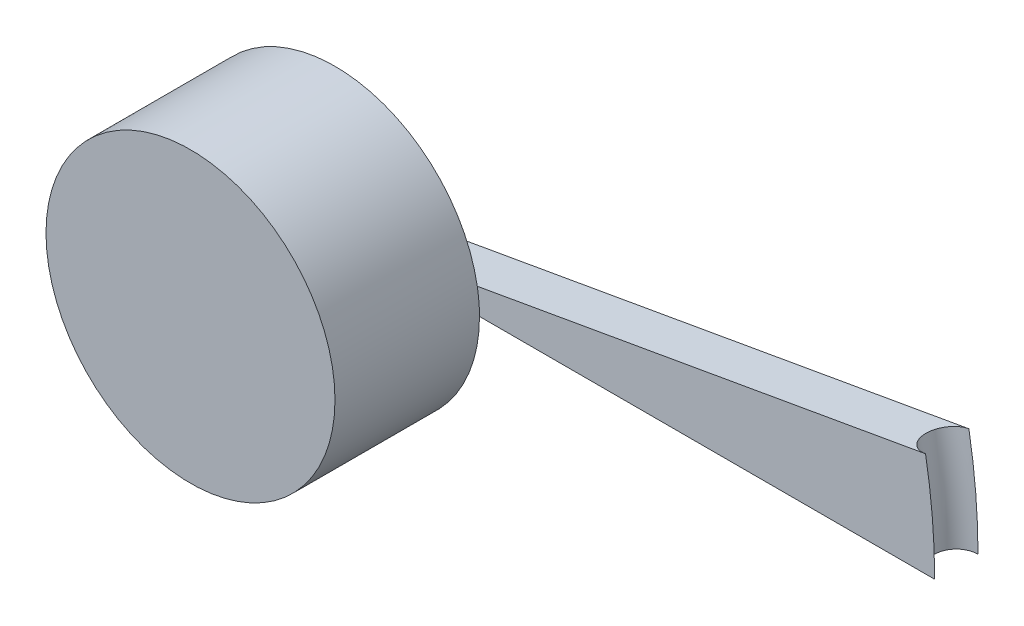
ISO-10303-21;
HEADER;
FILE_DESCRIPTION(('STEP AP214'),'2;1');
FILE_NAME('part.step','',(''),(''),'','','');
FILE_SCHEMA(('AUTOMOTIVE_DESIGN { 1 0 10303 214 1 1 1 1 }'));
ENDSEC;
DATA;
#1=APPLICATION_CONTEXT('core data for automotive mechanical design processes');
#2=APPLICATION_PROTOCOL_DEFINITION('international standard','automotive_design',2000,#1);
#3=PRODUCT_CONTEXT('',#1,'mechanical');
#4=PRODUCT('Part','Part','',(#3));
#5=PRODUCT_RELATED_PRODUCT_CATEGORY('part','',(#4));
#6=PRODUCT_DEFINITION_FORMATION('','',#4);
#7=PRODUCT_DEFINITION_CONTEXT('part definition',#1,'design');
#8=PRODUCT_DEFINITION('design','',#6,#7);
#9=PRODUCT_DEFINITION_SHAPE('','',#8);
#10=(LENGTH_UNIT() NAMED_UNIT(*) SI_UNIT(.MILLI.,.METRE.));
#11=(NAMED_UNIT(*) PLANE_ANGLE_UNIT() SI_UNIT($,.RADIAN.));
#12=(NAMED_UNIT(*) SI_UNIT($,.STERADIAN.) SOLID_ANGLE_UNIT());
#13=UNCERTAINTY_MEASURE_WITH_UNIT(LENGTH_MEASURE(1.E-05),#10,'distance_accuracy_value','');
#14=(GEOMETRIC_REPRESENTATION_CONTEXT(3) GLOBAL_UNCERTAINTY_ASSIGNED_CONTEXT((#13)) GLOBAL_UNIT_ASSIGNED_CONTEXT((#10,
#11,#12)) REPRESENTATION_CONTEXT('',''));
#15=CARTESIAN_POINT('',(0.,0.,0.));
#16=DIRECTION('',(0.,0.,1.));
#17=DIRECTION('',(1.,0.,0.));
#18=AXIS2_PLACEMENT_3D('',#15,#16,#17);
#19=CARTESIAN_POINT('',(40.8695217500066,7.20639937317762,1.5));
#20=DIRECTION('',(0.,0.,-1.));
#21=DIRECTION('',(-1.,0.,0.));
#22=AXIS2_PLACEMENT_3D('',#19,#20,#21);
#23=PLANE('',#22);
#24=CARTESIAN_POINT('',(0.,0.,1.50000000000001));
#25=DIRECTION('',(0.,0.,1.));
#26=DIRECTION('',(1.,0.,0.));
#27=AXIS2_PLACEMENT_3D('',#24,#25,#26);
#28=CIRCLE('',#27,10.);
#29=CARTESIAN_POINT('',(10.,0.,1.50000000000001));
#30=VERTEX_POINT('',#29);
#31=CARTESIAN_POINT('',(9.84807753012208,1.73648177666931,1.5));
#32=VERTEX_POINT('',#31);
#33=EDGE_CURVE('E87',#30,#32,#28,.T.);
#34=ORIENTED_EDGE('',*,*,#33,.F.);
#35=DIRECTION('',(1.,0.,0.));
#36=VECTOR('',#35,1.);
#37=CARTESIAN_POINT('',(0.,0.,1.5));
#38=LINE('',#37,#36);
#39=CARTESIAN_POINT('',(41.5,0.,1.5));
#40=VERTEX_POINT('',#39);
#41=EDGE_CURVE('E77',#30,#40,#38,.T.);
#42=ORIENTED_EDGE('',*,*,#41,.T.);
#43=CARTESIAN_POINT('',(0.,0.,1.50000000000002));
#44=DIRECTION('',(0.,0.,-1.));
#45=DIRECTION('',(-1.,0.,0.));
#46=AXIS2_PLACEMENT_3D('',#43,#44,#45);
#47=CIRCLE('',#46,41.5);
#48=CARTESIAN_POINT('',(40.8695217500066,7.20639937317762,1.5));
#49=VERTEX_POINT('',#48);
#50=EDGE_CURVE('E11',#49,#40,#47,.T.);
#51=ORIENTED_EDGE('',*,*,#50,.F.);
#52=DIRECTION('',(0.984807753012208,0.173648177666931,0.));
#53=VECTOR('',#52,1.);
#54=CARTESIAN_POINT('',(0.,0.,1.5));
#55=LINE('',#54,#53);
#56=EDGE_CURVE('E49',#32,#49,#55,.T.);
#57=ORIENTED_EDGE('',*,*,#56,.F.);
#58=EDGE_LOOP('',(#34,#42,#51,#57));
#59=FACE_BOUND('',#58,.T.);
#60=ADVANCED_FACE('F35',(#59),#23,.F.);
#61=CARTESIAN_POINT('',(0.,0.,0.));
#62=DIRECTION('',(0.,0.,-1.));
#63=DIRECTION('',(-1.,0.,0.));
#64=AXIS2_PLACEMENT_3D('',#61,#62,#63);
#65=TOROIDAL_SURFACE('',#64,41.5,1.5);
#66=CARTESIAN_POINT('',(0.,0.,-1.49999999999999));
#67=DIRECTION('',(0.,0.,-1.));
#68=DIRECTION('',(-1.,0.,0.));
#69=AXIS2_PLACEMENT_3D('',#66,#67,#68);
#70=CIRCLE('',#69,41.5);
#71=CARTESIAN_POINT('',(40.8695217500066,7.20639937317762,-1.5));
#72=VERTEX_POINT('',#71);
#73=CARTESIAN_POINT('',(41.5,0.,-1.5));
#74=VERTEX_POINT('',#73);
#75=EDGE_CURVE('E42',#72,#74,#70,.T.);
#76=ORIENTED_EDGE('',*,*,#75,.F.);
#77=CARTESIAN_POINT('',(40.8695217500066,7.20639937317762,0.));
#78=DIRECTION('',(0.173648177666931,-0.984807753012208,0.));
#79=DIRECTION('',(0.,0.,1.));
#80=AXIS2_PLACEMENT_3D('',#77,#78,#79);
#81=CIRCLE('',#80,1.5);
#82=EDGE_CURVE('E106',#49,#72,#81,.T.);
#83=ORIENTED_EDGE('',*,*,#82,.F.);
#84=ORIENTED_EDGE('',*,*,#50,.T.);
#85=CARTESIAN_POINT('',(41.5,0.,0.));
#86=DIRECTION('',(0.,-1.,0.));
#87=DIRECTION('',(0.,0.,1.));
#88=AXIS2_PLACEMENT_3D('',#85,#86,#87);
#89=CIRCLE('',#88,1.5);
#90=EDGE_CURVE('E83',#40,#74,#89,.T.);
#91=ORIENTED_EDGE('',*,*,#90,.T.);
#92=EDGE_LOOP('',(#76,#83,#84,#91));
#93=FACE_BOUND('',#92,.T.);
#94=ADVANCED_FACE('F113',(#93),#65,.F.);
#95=CARTESIAN_POINT('',(0.,0.,-1.49999999999999));
#96=DIRECTION('',(0.,0.,1.));
#97=DIRECTION('',(1.,0.,0.));
#98=AXIS2_PLACEMENT_3D('',#95,#96,#97);
#99=PLANE('',#98);
#100=DIRECTION('',(-1.,0.,0.));
#101=VECTOR('',#100,1.);
#102=CARTESIAN_POINT('',(0.,0.,-1.5));
#103=LINE('',#102,#101);
#104=CARTESIAN_POINT('',(0.,0.,-1.5));
#105=VERTEX_POINT('',#104);
#106=EDGE_CURVE('E101',#74,#105,#103,.T.);
#107=ORIENTED_EDGE('',*,*,#106,.T.);
#108=DIRECTION('',(-0.984807753012208,-0.173648177666931,0.));
#109=VECTOR('',#108,1.);
#110=CARTESIAN_POINT('',(39.3923101204883,6.94592710667723,-1.5));
#111=LINE('',#110,#109);
#112=EDGE_CURVE('E57',#72,#105,#111,.T.);
#113=ORIENTED_EDGE('',*,*,#112,.F.);
#114=ORIENTED_EDGE('',*,*,#75,.T.);
#115=EDGE_LOOP('',(#107,#113,#114));
#116=FACE_BOUND('',#115,.T.);
#117=ADVANCED_FACE('F110',(#116),#99,.F.);
#118=CARTESIAN_POINT('',(40.8695217500066,7.20639937317762,0.));
#119=DIRECTION('',(-0.173648177666931,0.984807753012208,0.));
#120=DIRECTION('',(0.,0.,1.));
#121=AXIS2_PLACEMENT_3D('',#118,#119,#120);
#122=PLANE('',#121);
#123=DIRECTION('',(0.,0.,1.));
#124=VECTOR('',#123,1.);
#125=CARTESIAN_POINT('',(0.,0.,-1.5));
#126=LINE('',#125,#124);
#127=CARTESIAN_POINT('',(0.,0.,1.5));
#128=VERTEX_POINT('',#127);
#129=EDGE_CURVE('E103',#105,#128,#126,.T.);
#130=ORIENTED_EDGE('',*,*,#129,.T.);
#131=EDGE_CURVE('E96',#128,#32,#55,.T.);
#132=ORIENTED_EDGE('',*,*,#131,.T.);
#133=ORIENTED_EDGE('',*,*,#56,.T.);
#134=ORIENTED_EDGE('',*,*,#82,.T.);
#135=ORIENTED_EDGE('',*,*,#112,.T.);
#136=EDGE_LOOP('',(#130,#132,#133,#134,#135));
#137=FACE_BOUND('',#136,.T.);
#138=ADVANCED_FACE('F114',(#137),#122,.T.);
#139=CARTESIAN_POINT('',(41.5,0.,0.));
#140=DIRECTION('',(0.,1.,0.));
#141=DIRECTION('',(0.,0.,1.));
#142=AXIS2_PLACEMENT_3D('',#139,#140,#141);
#143=PLANE('',#142);
#144=ORIENTED_EDGE('',*,*,#129,.F.);
#145=ORIENTED_EDGE('',*,*,#106,.F.);
#146=ORIENTED_EDGE('',*,*,#90,.F.);
#147=ORIENTED_EDGE('',*,*,#41,.F.);
#148=EDGE_CURVE('E81',#128,#30,#38,.T.);
#149=ORIENTED_EDGE('',*,*,#148,.F.);
#150=EDGE_LOOP('',(#144,#145,#146,#147,#149));
#151=FACE_BOUND('',#150,.T.);
#152=ADVANCED_FACE('F79',(#151),#143,.F.);
#153=CARTESIAN_POINT('',(0.,0.,11.5));
#154=DIRECTION('',(0.,0.,-1.));
#155=DIRECTION('',(-1.,0.,0.));
#156=AXIS2_PLACEMENT_3D('',#153,#154,#155);
#157=CYLINDRICAL_SURFACE('',#156,10.);
#158=CARTESIAN_POINT('',(0.,0.,11.5));
#159=DIRECTION('',(0.,0.,1.));
#160=DIRECTION('',(1.,0.,0.));
#161=AXIS2_PLACEMENT_3D('',#158,#159,#160);
#162=CIRCLE('',#161,10.);
#163=CARTESIAN_POINT('',(10.,0.,11.5));
#164=VERTEX_POINT('',#163);
#165=EDGE_CURVE('E84',#164,#164,#162,.T.);
#166=ORIENTED_EDGE('',*,*,#165,.F.);
#167=EDGE_LOOP('',(#166));
#168=FACE_BOUND('',#167,.T.);
#169=ORIENTED_EDGE('',*,*,#33,.T.);
#170=EDGE_CURVE('E90',#32,#30,#28,.T.);
#171=ORIENTED_EDGE('',*,*,#170,.T.);
#172=EDGE_LOOP('',(#169,#171));
#173=FACE_BOUND('',#172,.T.);
#174=ADVANCED_FACE('F97',(#168,#173),#157,.T.);
#175=CARTESIAN_POINT('',(0.,0.,11.5));
#176=DIRECTION('',(0.,0.,1.));
#177=DIRECTION('',(1.,0.,0.));
#178=AXIS2_PLACEMENT_3D('',#175,#176,#177);
#179=PLANE('',#178);
#180=ORIENTED_EDGE('',*,*,#165,.T.);
#181=EDGE_LOOP('',(#180));
#182=FACE_BOUND('',#181,.T.);
#183=ADVANCED_FACE('F158',(#182),#179,.T.);
#184=CARTESIAN_POINT('',(0.,0.,1.50000000000001));
#185=DIRECTION('',(0.,0.,1.));
#186=DIRECTION('',(1.,0.,0.));
#187=AXIS2_PLACEMENT_3D('',#184,#185,#186);
#188=PLANE('',#187);
#189=ORIENTED_EDGE('',*,*,#131,.F.);
#190=ORIENTED_EDGE('',*,*,#148,.T.);
#191=ORIENTED_EDGE('',*,*,#170,.F.);
#192=EDGE_LOOP('',(#189,#190,#191));
#193=FACE_BOUND('',#192,.T.);
#194=ADVANCED_FACE('F95',(#193),#188,.F.);
#195=CLOSED_SHELL('',(#60,#94,#117,#138,#152,#174,#183,#194));
#196=MANIFOLD_SOLID_BREP('B2',#195);
#197=ADVANCED_BREP_SHAPE_REPRESENTATION('',(#18,#196),#14);
#198=SHAPE_DEFINITION_REPRESENTATION(#9,#197);
ENDSEC;
END-ISO-10303-21;
